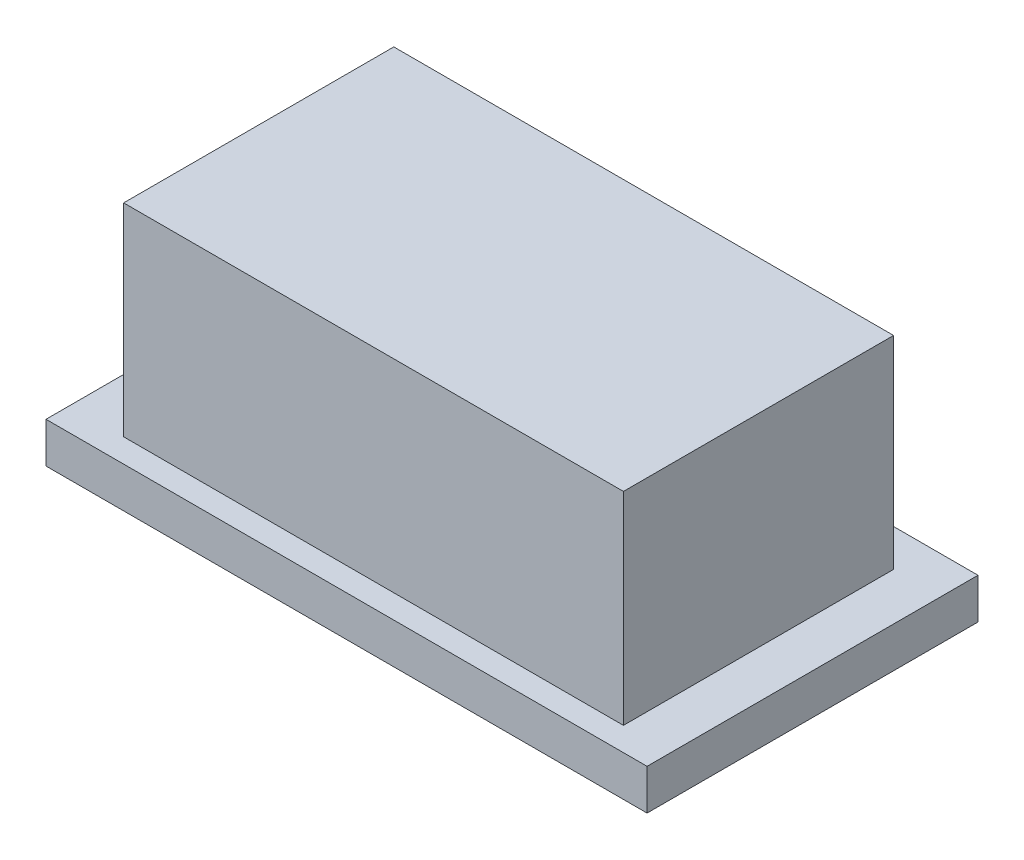
ISO-10303-21;
HEADER;
FILE_DESCRIPTION(('STEP AP214'),'2;1');
FILE_NAME('part.step','',(''),(''),'','','');
FILE_SCHEMA(('AUTOMOTIVE_DESIGN { 1 0 10303 214 1 1 1 1 }'));
ENDSEC;
DATA;
#1=APPLICATION_CONTEXT('core data for automotive mechanical design processes');
#2=APPLICATION_PROTOCOL_DEFINITION('international standard','automotive_design',2000,#1);
#3=PRODUCT_CONTEXT('',#1,'mechanical');
#4=PRODUCT('Part','Part','',(#3));
#5=PRODUCT_RELATED_PRODUCT_CATEGORY('part','',(#4));
#6=PRODUCT_DEFINITION_FORMATION('','',#4);
#7=PRODUCT_DEFINITION_CONTEXT('part definition',#1,'design');
#8=PRODUCT_DEFINITION('design','',#6,#7);
#9=PRODUCT_DEFINITION_SHAPE('','',#8);
#10=(LENGTH_UNIT() NAMED_UNIT(*) SI_UNIT(.MILLI.,.METRE.));
#11=(NAMED_UNIT(*) PLANE_ANGLE_UNIT() SI_UNIT($,.RADIAN.));
#12=(NAMED_UNIT(*) SI_UNIT($,.STERADIAN.) SOLID_ANGLE_UNIT());
#13=UNCERTAINTY_MEASURE_WITH_UNIT(LENGTH_MEASURE(1.E-05),#10,'distance_accuracy_value','');
#14=(GEOMETRIC_REPRESENTATION_CONTEXT(3) GLOBAL_UNCERTAINTY_ASSIGNED_CONTEXT((#13)) GLOBAL_UNIT_ASSIGNED_CONTEXT((#10,
#11,#12)) REPRESENTATION_CONTEXT('',''));
#15=CARTESIAN_POINT('',(0.,0.,0.));
#16=DIRECTION('',(0.,0.,1.));
#17=DIRECTION('',(1.,0.,0.));
#18=AXIS2_PLACEMENT_3D('',#15,#16,#17);
#19=CARTESIAN_POINT('',(0.,1.2,0.));
#20=DIRECTION('',(0.,1.,0.));
#21=DIRECTION('',(0.,0.,1.));
#22=AXIS2_PLACEMENT_3D('',#19,#20,#21);
#23=PLANE('',#22);
#24=DIRECTION('',(0.,0.,-1.));
#25=VECTOR('',#24,1.);
#26=CARTESIAN_POINT('',(0.,1.2,0.));
#27=LINE('',#26,#25);
#28=CARTESIAN_POINT('',(0.,1.2,0.));
#29=VERTEX_POINT('',#28);
#30=CARTESIAN_POINT('',(0.,1.2,-9.8));
#31=VERTEX_POINT('',#30);
#32=EDGE_CURVE('E142',#29,#31,#27,.T.);
#33=ORIENTED_EDGE('',*,*,#32,.T.);
#34=DIRECTION('',(-1.,0.,0.));
#35=VECTOR('',#34,1.);
#36=CARTESIAN_POINT('',(0.,1.2,-9.8));
#37=LINE('',#36,#35);
#38=CARTESIAN_POINT('',(-17.8,1.2,-9.8));
#39=VERTEX_POINT('',#38);
#40=EDGE_CURVE('E87',#31,#39,#37,.T.);
#41=ORIENTED_EDGE('',*,*,#40,.T.);
#42=DIRECTION('',(0.,0.,1.));
#43=VECTOR('',#42,1.);
#44=CARTESIAN_POINT('',(-17.8,1.2,0.));
#45=LINE('',#44,#43);
#46=CARTESIAN_POINT('',(-17.8,1.2,0.));
#47=VERTEX_POINT('',#46);
#48=EDGE_CURVE('E145',#39,#47,#45,.T.);
#49=ORIENTED_EDGE('',*,*,#48,.T.);
#50=DIRECTION('',(1.,0.,0.));
#51=VECTOR('',#50,1.);
#52=CARTESIAN_POINT('',(0.,1.2,0.));
#53=LINE('',#52,#51);
#54=EDGE_CURVE('E59',#47,#29,#53,.T.);
#55=ORIENTED_EDGE('',*,*,#54,.T.);
#56=EDGE_LOOP('',(#33,#41,#49,#55));
#57=FACE_BOUND('',#56,.T.);
#58=DIRECTION('',(-1.,0.,0.));
#59=VECTOR('',#58,1.);
#60=CARTESIAN_POINT('',(-1.4,1.2,-8.7));
#61=LINE('',#60,#59);
#62=CARTESIAN_POINT('',(-1.4,1.2,-8.7));
#63=VERTEX_POINT('',#62);
#64=CARTESIAN_POINT('',(-16.2,1.2,-8.7));
#65=VERTEX_POINT('',#64);
#66=EDGE_CURVE('E265',#63,#65,#61,.T.);
#67=ORIENTED_EDGE('',*,*,#66,.F.);
#68=DIRECTION('',(0.,0.,-1.));
#69=VECTOR('',#68,1.);
#70=CARTESIAN_POINT('',(-1.4,1.2,-0.7));
#71=LINE('',#70,#69);
#72=CARTESIAN_POINT('',(-1.4,1.2,-0.7));
#73=VERTEX_POINT('',#72);
#74=EDGE_CURVE('E132',#73,#63,#71,.T.);
#75=ORIENTED_EDGE('',*,*,#74,.F.);
#76=DIRECTION('',(1.,0.,0.));
#77=VECTOR('',#76,1.);
#78=CARTESIAN_POINT('',(-1.4,1.2,-0.7));
#79=LINE('',#78,#77);
#80=CARTESIAN_POINT('',(-16.2,1.2,-0.699999999999998));
#81=VERTEX_POINT('',#80);
#82=EDGE_CURVE('E128',#81,#73,#79,.T.);
#83=ORIENTED_EDGE('',*,*,#82,.F.);
#84=DIRECTION('',(0.,0.,1.));
#85=VECTOR('',#84,1.);
#86=CARTESIAN_POINT('',(-16.2,1.2,-0.699999999999998));
#87=LINE('',#86,#85);
#88=EDGE_CURVE('E262',#65,#81,#87,.T.);
#89=ORIENTED_EDGE('',*,*,#88,.F.);
#90=EDGE_LOOP('',(#67,#75,#83,#89));
#91=FACE_BOUND('',#90,.T.);
#92=ADVANCED_FACE('F35',(#57,#91),#23,.T.);
#93=CARTESIAN_POINT('',(0.,1.2,0.));
#94=DIRECTION('',(-1.,0.,0.));
#95=DIRECTION('',(0.,0.,1.));
#96=AXIS2_PLACEMENT_3D('',#93,#94,#95);
#97=PLANE('',#96);
#98=DIRECTION('',(0.,0.,-1.));
#99=VECTOR('',#98,1.);
#100=CARTESIAN_POINT('',(0.,0.,0.));
#101=LINE('',#100,#99);
#102=CARTESIAN_POINT('',(0.,0.,0.));
#103=VERTEX_POINT('',#102);
#104=CARTESIAN_POINT('',(0.,0.,-9.8));
#105=VERTEX_POINT('',#104);
#106=EDGE_CURVE('E134',#103,#105,#101,.T.);
#107=ORIENTED_EDGE('',*,*,#106,.T.);
#108=DIRECTION('',(0.,-1.,0.));
#109=VECTOR('',#108,1.);
#110=CARTESIAN_POINT('',(0.,1.2,-9.8));
#111=LINE('',#110,#109);
#112=EDGE_CURVE('E11',#31,#105,#111,.T.);
#113=ORIENTED_EDGE('',*,*,#112,.F.);
#114=ORIENTED_EDGE('',*,*,#32,.F.);
#115=DIRECTION('',(0.,-1.,0.));
#116=VECTOR('',#115,1.);
#117=CARTESIAN_POINT('',(0.,1.2,0.));
#118=LINE('',#117,#116);
#119=EDGE_CURVE('E147',#29,#103,#118,.T.);
#120=ORIENTED_EDGE('',*,*,#119,.T.);
#121=EDGE_LOOP('',(#107,#113,#114,#120));
#122=FACE_BOUND('',#121,.T.);
#123=ADVANCED_FACE('F37',(#122),#97,.F.);
#124=CARTESIAN_POINT('',(0.,1.2,-9.8));
#125=DIRECTION('',(0.,0.,1.));
#126=DIRECTION('',(1.,0.,0.));
#127=AXIS2_PLACEMENT_3D('',#124,#125,#126);
#128=PLANE('',#127);
#129=DIRECTION('',(-1.,0.,0.));
#130=VECTOR('',#129,1.);
#131=CARTESIAN_POINT('',(0.,0.,-9.8));
#132=LINE('',#131,#130);
#133=CARTESIAN_POINT('',(-17.8,0.,-9.8));
#134=VERTEX_POINT('',#133);
#135=EDGE_CURVE('E137',#105,#134,#132,.T.);
#136=ORIENTED_EDGE('',*,*,#135,.T.);
#137=DIRECTION('',(0.,-1.,0.));
#138=VECTOR('',#137,1.);
#139=CARTESIAN_POINT('',(-17.8,1.2,-9.8));
#140=LINE('',#139,#138);
#141=EDGE_CURVE('E43',#39,#134,#140,.T.);
#142=ORIENTED_EDGE('',*,*,#141,.F.);
#143=ORIENTED_EDGE('',*,*,#40,.F.);
#144=ORIENTED_EDGE('',*,*,#112,.T.);
#145=EDGE_LOOP('',(#136,#142,#143,#144));
#146=FACE_BOUND('',#145,.T.);
#147=ADVANCED_FACE('F175',(#146),#128,.F.);
#148=CARTESIAN_POINT('',(-17.8,1.2,0.));
#149=DIRECTION('',(1.,0.,0.));
#150=DIRECTION('',(0.,0.,-1.));
#151=AXIS2_PLACEMENT_3D('',#148,#149,#150);
#152=PLANE('',#151);
#153=DIRECTION('',(0.,0.,1.));
#154=VECTOR('',#153,1.);
#155=CARTESIAN_POINT('',(-17.8,0.,0.));
#156=LINE('',#155,#154);
#157=CARTESIAN_POINT('',(-17.8,0.,0.));
#158=VERTEX_POINT('',#157);
#159=EDGE_CURVE('E150',#134,#158,#156,.T.);
#160=ORIENTED_EDGE('',*,*,#159,.T.);
#161=DIRECTION('',(0.,-1.,0.));
#162=VECTOR('',#161,1.);
#163=CARTESIAN_POINT('',(-17.8,1.2,0.));
#164=LINE('',#163,#162);
#165=EDGE_CURVE('E154',#47,#158,#164,.T.);
#166=ORIENTED_EDGE('',*,*,#165,.F.);
#167=ORIENTED_EDGE('',*,*,#48,.F.);
#168=ORIENTED_EDGE('',*,*,#141,.T.);
#169=EDGE_LOOP('',(#160,#166,#167,#168));
#170=FACE_BOUND('',#169,.T.);
#171=ADVANCED_FACE('F159',(#170),#152,.F.);
#172=CARTESIAN_POINT('',(0.,1.2,0.));
#173=DIRECTION('',(0.,0.,-1.));
#174=DIRECTION('',(-1.,0.,0.));
#175=AXIS2_PLACEMENT_3D('',#172,#173,#174);
#176=PLANE('',#175);
#177=DIRECTION('',(1.,0.,0.));
#178=VECTOR('',#177,1.);
#179=CARTESIAN_POINT('',(0.,0.,0.));
#180=LINE('',#179,#178);
#181=EDGE_CURVE('E80',#158,#103,#180,.T.);
#182=ORIENTED_EDGE('',*,*,#181,.T.);
#183=ORIENTED_EDGE('',*,*,#119,.F.);
#184=ORIENTED_EDGE('',*,*,#54,.F.);
#185=ORIENTED_EDGE('',*,*,#165,.T.);
#186=EDGE_LOOP('',(#182,#183,#184,#185));
#187=FACE_BOUND('',#186,.T.);
#188=ADVANCED_FACE('F167',(#187),#176,.F.);
#189=CARTESIAN_POINT('',(0.,0.,0.));
#190=DIRECTION('',(0.,1.,0.));
#191=DIRECTION('',(0.,0.,1.));
#192=AXIS2_PLACEMENT_3D('',#189,#190,#191);
#193=PLANE('',#192);
#194=ORIENTED_EDGE('',*,*,#106,.F.);
#195=ORIENTED_EDGE('',*,*,#181,.F.);
#196=ORIENTED_EDGE('',*,*,#159,.F.);
#197=ORIENTED_EDGE('',*,*,#135,.F.);
#198=EDGE_LOOP('',(#194,#195,#196,#197));
#199=FACE_BOUND('',#198,.T.);
#200=ADVANCED_FACE('F163',(#199),#193,.F.);
#201=CARTESIAN_POINT('',(-1.4,7.2,-0.7));
#202=DIRECTION('',(-1.,0.,0.));
#203=DIRECTION('',(0.,0.,1.));
#204=AXIS2_PLACEMENT_3D('',#201,#202,#203);
#205=PLANE('',#204);
#206=ORIENTED_EDGE('',*,*,#74,.T.);
#207=DIRECTION('',(0.,-1.,0.));
#208=VECTOR('',#207,1.);
#209=CARTESIAN_POINT('',(-1.4,7.2,-8.7));
#210=LINE('',#209,#208);
#211=CARTESIAN_POINT('',(-1.4,7.2,-8.7));
#212=VERTEX_POINT('',#211);
#213=EDGE_CURVE('E113',#212,#63,#210,.T.);
#214=ORIENTED_EDGE('',*,*,#213,.F.);
#215=DIRECTION('',(0.,0.,-1.));
#216=VECTOR('',#215,1.);
#217=CARTESIAN_POINT('',(-1.4,7.2,-0.7));
#218=LINE('',#217,#216);
#219=CARTESIAN_POINT('',(-1.4,7.2,-0.7));
#220=VERTEX_POINT('',#219);
#221=EDGE_CURVE('E120',#220,#212,#218,.T.);
#222=ORIENTED_EDGE('',*,*,#221,.F.);
#223=DIRECTION('',(0.,-1.,0.));
#224=VECTOR('',#223,1.);
#225=CARTESIAN_POINT('',(-1.4,7.2,-0.7));
#226=LINE('',#225,#224);
#227=EDGE_CURVE('E260',#220,#73,#226,.T.);
#228=ORIENTED_EDGE('',*,*,#227,.T.);
#229=EDGE_LOOP('',(#206,#214,#222,#228));
#230=FACE_BOUND('',#229,.T.);
#231=ADVANCED_FACE('F130',(#230),#205,.F.);
#232=CARTESIAN_POINT('',(-1.4,7.2,-8.7));
#233=DIRECTION('',(0.,0.,1.));
#234=DIRECTION('',(1.,0.,0.));
#235=AXIS2_PLACEMENT_3D('',#232,#233,#234);
#236=PLANE('',#235);
#237=ORIENTED_EDGE('',*,*,#66,.T.);
#238=DIRECTION('',(0.,-1.,0.));
#239=VECTOR('',#238,1.);
#240=CARTESIAN_POINT('',(-16.2,7.2,-8.7));
#241=LINE('',#240,#239);
#242=CARTESIAN_POINT('',(-16.2,7.2,-8.7));
#243=VERTEX_POINT('',#242);
#244=EDGE_CURVE('E116',#243,#65,#241,.T.);
#245=ORIENTED_EDGE('',*,*,#244,.F.);
#246=DIRECTION('',(-1.,0.,0.));
#247=VECTOR('',#246,1.);
#248=CARTESIAN_POINT('',(-1.4,7.2,-8.7));
#249=LINE('',#248,#247);
#250=EDGE_CURVE('E109',#212,#243,#249,.T.);
#251=ORIENTED_EDGE('',*,*,#250,.F.);
#252=ORIENTED_EDGE('',*,*,#213,.T.);
#253=EDGE_LOOP('',(#237,#245,#251,#252));
#254=FACE_BOUND('',#253,.T.);
#255=ADVANCED_FACE('F111',(#254),#236,.F.);
#256=CARTESIAN_POINT('',(-16.2,7.2,-0.699999999999998));
#257=DIRECTION('',(1.,0.,0.));
#258=DIRECTION('',(0.,0.,-1.));
#259=AXIS2_PLACEMENT_3D('',#256,#257,#258);
#260=PLANE('',#259);
#261=ORIENTED_EDGE('',*,*,#88,.T.);
#262=DIRECTION('',(0.,-1.,0.));
#263=VECTOR('',#262,1.);
#264=CARTESIAN_POINT('',(-16.2,7.2,-0.699999999999998));
#265=LINE('',#264,#263);
#266=CARTESIAN_POINT('',(-16.2,7.2,-0.699999999999998));
#267=VERTEX_POINT('',#266);
#268=EDGE_CURVE('E50',#267,#81,#265,.T.);
#269=ORIENTED_EDGE('',*,*,#268,.F.);
#270=DIRECTION('',(0.,0.,1.));
#271=VECTOR('',#270,1.);
#272=CARTESIAN_POINT('',(-16.2,7.2,-0.699999999999998));
#273=LINE('',#272,#271);
#274=EDGE_CURVE('E119',#243,#267,#273,.T.);
#275=ORIENTED_EDGE('',*,*,#274,.F.);
#276=ORIENTED_EDGE('',*,*,#244,.T.);
#277=EDGE_LOOP('',(#261,#269,#275,#276));
#278=FACE_BOUND('',#277,.T.);
#279=ADVANCED_FACE('F188',(#278),#260,.F.);
#280=CARTESIAN_POINT('',(-1.4,7.2,-0.7));
#281=DIRECTION('',(0.,0.,-1.));
#282=DIRECTION('',(-1.,0.,0.));
#283=AXIS2_PLACEMENT_3D('',#280,#281,#282);
#284=PLANE('',#283);
#285=ORIENTED_EDGE('',*,*,#82,.T.);
#286=ORIENTED_EDGE('',*,*,#227,.F.);
#287=DIRECTION('',(1.,0.,0.));
#288=VECTOR('',#287,1.);
#289=CARTESIAN_POINT('',(-1.4,7.2,-0.7));
#290=LINE('',#289,#288);
#291=EDGE_CURVE('E124',#267,#220,#290,.T.);
#292=ORIENTED_EDGE('',*,*,#291,.F.);
#293=ORIENTED_EDGE('',*,*,#268,.T.);
#294=EDGE_LOOP('',(#285,#286,#292,#293));
#295=FACE_BOUND('',#294,.T.);
#296=ADVANCED_FACE('F191',(#295),#284,.F.);
#297=CARTESIAN_POINT('',(0.,7.2,0.));
#298=DIRECTION('',(0.,1.,0.));
#299=DIRECTION('',(0.,0.,1.));
#300=AXIS2_PLACEMENT_3D('',#297,#298,#299);
#301=PLANE('',#300);
#302=ORIENTED_EDGE('',*,*,#221,.T.);
#303=ORIENTED_EDGE('',*,*,#250,.T.);
#304=ORIENTED_EDGE('',*,*,#274,.T.);
#305=ORIENTED_EDGE('',*,*,#291,.T.);
#306=EDGE_LOOP('',(#302,#303,#304,#305));
#307=FACE_BOUND('',#306,.T.);
#308=ADVANCED_FACE('F123',(#307),#301,.T.);
#309=CLOSED_SHELL('',(#92,#123,#147,#171,#188,#200,#231,#255,#279,#296,#308));
#310=MANIFOLD_SOLID_BREP('B2',#309);
#311=ADVANCED_BREP_SHAPE_REPRESENTATION('',(#18,#310),#14);
#312=SHAPE_DEFINITION_REPRESENTATION(#9,#311);
ENDSEC;
END-ISO-10303-21;
